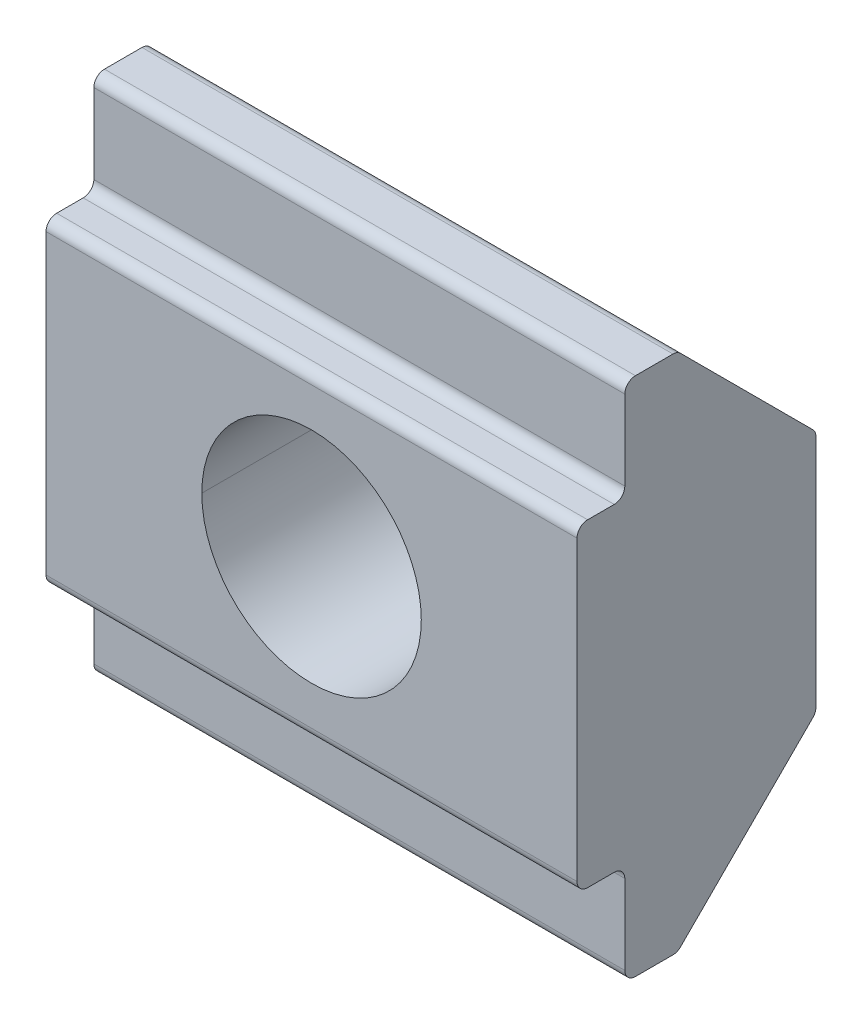
ISO-10303-21;
HEADER;
FILE_DESCRIPTION(('STEP AP214'),'2;1');
FILE_NAME('part.step','',(''),(''),'','','');
FILE_SCHEMA(('AUTOMOTIVE_DESIGN { 1 0 10303 214 1 1 1 1 }'));
ENDSEC;
DATA;
#1=APPLICATION_CONTEXT('core data for automotive mechanical design processes');
#2=APPLICATION_PROTOCOL_DEFINITION('international standard','automotive_design',2000,#1);
#3=PRODUCT_CONTEXT('',#1,'mechanical');
#4=PRODUCT('Part','Part','',(#3));
#5=PRODUCT_RELATED_PRODUCT_CATEGORY('part','',(#4));
#6=PRODUCT_DEFINITION_FORMATION('','',#4);
#7=PRODUCT_DEFINITION_CONTEXT('part definition',#1,'design');
#8=PRODUCT_DEFINITION('design','',#6,#7);
#9=PRODUCT_DEFINITION_SHAPE('','',#8);
#10=(LENGTH_UNIT() NAMED_UNIT(*) SI_UNIT(.MILLI.,.METRE.));
#11=(NAMED_UNIT(*) PLANE_ANGLE_UNIT() SI_UNIT($,.RADIAN.));
#12=(NAMED_UNIT(*) SI_UNIT($,.STERADIAN.) SOLID_ANGLE_UNIT());
#13=UNCERTAINTY_MEASURE_WITH_UNIT(LENGTH_MEASURE(1.E-05),#10,'distance_accuracy_value','');
#14=(GEOMETRIC_REPRESENTATION_CONTEXT(3) GLOBAL_UNCERTAINTY_ASSIGNED_CONTEXT((#13)) GLOBAL_UNIT_ASSIGNED_CONTEXT((#10,
#11,#12)) REPRESENTATION_CONTEXT('',''));
#15=CARTESIAN_POINT('',(0.,0.,0.));
#16=DIRECTION('',(0.,0.,1.));
#17=DIRECTION('',(1.,0.,0.));
#18=AXIS2_PLACEMENT_3D('',#15,#16,#17);
#19=CARTESIAN_POINT('',(5.,-2.20715728752538,-4.3));
#20=DIRECTION('',(-1.,0.,0.));
#21=DIRECTION('',(0.,0.382683432365152,0.923879532511261));
#22=AXIS2_PLACEMENT_3D('',#19,#20,#21);
#23=CYLINDRICAL_SURFACE('',#22,0.20000000000003);
#24=CARTESIAN_POINT('',(-5.,-2.20715728752538,-4.3));
#25=DIRECTION('',(1.,0.,0.));
#26=DIRECTION('',(0.,0.,1.));
#27=AXIS2_PLACEMENT_3D('',#24,#25,#26);
#28=CIRCLE('',#27,0.20000000000003);
#29=CARTESIAN_POINT('',(-5.,-2.3485786437627,-4.44142135623731));
#30=VERTEX_POINT('',#29);
#31=CARTESIAN_POINT('',(-5.,-2.2071572875254,-4.5));
#32=VERTEX_POINT('',#31);
#33=EDGE_CURVE('E10',#30,#32,#28,.T.);
#34=ORIENTED_EDGE('',*,*,#33,.T.);
#35=DIRECTION('',(-1.,0.,0.));
#36=VECTOR('',#35,1.);
#37=CARTESIAN_POINT('',(5.,-2.2071572875254,-4.5));
#38=LINE('',#37,#36);
#39=CARTESIAN_POINT('',(5.,-2.2071572875254,-4.5));
#40=VERTEX_POINT('',#39);
#41=EDGE_CURVE('E24',#40,#32,#38,.T.);
#42=ORIENTED_EDGE('',*,*,#41,.F.);
#43=CARTESIAN_POINT('',(5.,-2.20715728752538,-4.3));
#44=DIRECTION('',(1.,0.,0.));
#45=DIRECTION('',(0.,0.,1.));
#46=AXIS2_PLACEMENT_3D('',#43,#44,#45);
#47=CIRCLE('',#46,0.20000000000003);
#48=CARTESIAN_POINT('',(5.,-2.3485786437627,-4.44142135623731));
#49=VERTEX_POINT('',#48);
#50=EDGE_CURVE('E446',#49,#40,#47,.T.);
#51=ORIENTED_EDGE('',*,*,#50,.F.);
#52=DIRECTION('',(-1.,0.,0.));
#53=VECTOR('',#52,1.);
#54=CARTESIAN_POINT('',(5.,-2.3485786437627,-4.44142135623731));
#55=LINE('',#54,#53);
#56=EDGE_CURVE('E442',#49,#30,#55,.T.);
#57=ORIENTED_EDGE('',*,*,#56,.T.);
#58=EDGE_LOOP('',(#34,#42,#51,#57));
#59=FACE_BOUND('',#58,.T.);
#60=ADVANCED_FACE('F16',(#59),#23,.T.);
#61=CARTESIAN_POINT('',(5.,-4.8414213562373,-1.9485786437627));
#62=DIRECTION('',(0.,0.707106781186549,0.707106781186546));
#63=DIRECTION('',(0.,-0.707106781186546,0.707106781186549));
#64=AXIS2_PLACEMENT_3D('',#61,#62,#63);
#65=PLANE('',#64);
#66=DIRECTION('',(0.,0.707106781186546,-0.707106781186549));
#67=VECTOR('',#66,1.);
#68=CARTESIAN_POINT('',(-5.,-4.8414213562373,-1.9485786437627));
#69=LINE('',#68,#67);
#70=CARTESIAN_POINT('',(-5.,-4.8414213562373,-1.9485786437627));
#71=VERTEX_POINT('',#70);
#72=EDGE_CURVE('E437',#71,#30,#69,.T.);
#73=ORIENTED_EDGE('',*,*,#72,.T.);
#74=ORIENTED_EDGE('',*,*,#56,.F.);
#75=DIRECTION('',(0.,0.707106781186546,-0.707106781186549));
#76=VECTOR('',#75,1.);
#77=CARTESIAN_POINT('',(5.,-4.8414213562373,-1.9485786437627));
#78=LINE('',#77,#76);
#79=CARTESIAN_POINT('',(5.,-4.8414213562373,-1.9485786437627));
#80=VERTEX_POINT('',#79);
#81=EDGE_CURVE('E432',#80,#49,#78,.T.);
#82=ORIENTED_EDGE('',*,*,#81,.F.);
#83=DIRECTION('',(-1.,0.,0.));
#84=VECTOR('',#83,1.);
#85=CARTESIAN_POINT('',(5.,-4.8414213562373,-1.9485786437627));
#86=LINE('',#85,#84);
#87=EDGE_CURVE('E428',#80,#71,#86,.T.);
#88=ORIENTED_EDGE('',*,*,#87,.T.);
#89=EDGE_LOOP('',(#73,#74,#82,#88));
#90=FACE_BOUND('',#89,.T.);
#91=ADVANCED_FACE('F466',(#90),#65,.F.);
#92=CARTESIAN_POINT('',(5.,-4.70000000000049,-1.80715728752558));
#93=DIRECTION('',(-1.,0.,0.));
#94=DIRECTION('',(0.,0.923879532511249,0.382683432365181));
#95=AXIS2_PLACEMENT_3D('',#92,#93,#94);
#96=CYLINDRICAL_SURFACE('',#95,0.199999999999515);
#97=CARTESIAN_POINT('',(-5.,-4.70000000000049,-1.80715728752558));
#98=DIRECTION('',(1.,0.,0.));
#99=DIRECTION('',(0.,0.,1.));
#100=AXIS2_PLACEMENT_3D('',#97,#98,#99);
#101=CIRCLE('',#100,0.199999999999515);
#102=CARTESIAN_POINT('',(-5.,-4.9,-1.8071572875254));
#103=VERTEX_POINT('',#102);
#104=EDGE_CURVE('E423',#103,#71,#101,.T.);
#105=ORIENTED_EDGE('',*,*,#104,.T.);
#106=ORIENTED_EDGE('',*,*,#87,.F.);
#107=CARTESIAN_POINT('',(5.,-4.70000000000049,-1.80715728752558));
#108=DIRECTION('',(1.,0.,0.));
#109=DIRECTION('',(0.,0.,1.));
#110=AXIS2_PLACEMENT_3D('',#107,#108,#109);
#111=CIRCLE('',#110,0.199999999999515);
#112=CARTESIAN_POINT('',(5.,-4.9,-1.8071572875254));
#113=VERTEX_POINT('',#112);
#114=EDGE_CURVE('E418',#113,#80,#111,.T.);
#115=ORIENTED_EDGE('',*,*,#114,.F.);
#116=DIRECTION('',(-1.,0.,0.));
#117=VECTOR('',#116,1.);
#118=CARTESIAN_POINT('',(5.,-4.9,-1.8071572875254));
#119=LINE('',#118,#117);
#120=EDGE_CURVE('E414',#113,#103,#119,.T.);
#121=ORIENTED_EDGE('',*,*,#120,.T.);
#122=EDGE_LOOP('',(#105,#106,#115,#121));
#123=FACE_BOUND('',#122,.T.);
#124=ADVANCED_FACE('F547',(#123),#96,.T.);
#125=CARTESIAN_POINT('',(5.,-4.9,-1.1));
#126=DIRECTION('',(0.,1.,0.));
#127=DIRECTION('',(0.,0.,1.));
#128=AXIS2_PLACEMENT_3D('',#125,#126,#127);
#129=PLANE('',#128);
#130=DIRECTION('',(0.,0.,-1.));
#131=VECTOR('',#130,1.);
#132=CARTESIAN_POINT('',(-5.,-4.9,-1.1));
#133=LINE('',#132,#131);
#134=CARTESIAN_POINT('',(-5.,-4.9,-1.1));
#135=VERTEX_POINT('',#134);
#136=EDGE_CURVE('E409',#135,#103,#133,.T.);
#137=ORIENTED_EDGE('',*,*,#136,.T.);
#138=ORIENTED_EDGE('',*,*,#120,.F.);
#139=DIRECTION('',(0.,0.,-1.));
#140=VECTOR('',#139,1.);
#141=CARTESIAN_POINT('',(5.,-4.9,-1.1));
#142=LINE('',#141,#140);
#143=CARTESIAN_POINT('',(5.,-4.9,-1.1));
#144=VERTEX_POINT('',#143);
#145=EDGE_CURVE('E404',#144,#113,#142,.T.);
#146=ORIENTED_EDGE('',*,*,#145,.F.);
#147=DIRECTION('',(-1.,0.,0.));
#148=VECTOR('',#147,1.);
#149=CARTESIAN_POINT('',(5.,-4.9,-1.1));
#150=LINE('',#149,#148);
#151=EDGE_CURVE('E400',#144,#135,#150,.T.);
#152=ORIENTED_EDGE('',*,*,#151,.T.);
#153=EDGE_LOOP('',(#137,#138,#146,#152));
#154=FACE_BOUND('',#153,.T.);
#155=ADVANCED_FACE('F544',(#154),#129,.F.);
#156=CARTESIAN_POINT('',(5.,-4.7,-1.10000000000003));
#157=DIRECTION('',(-1.,0.,0.));
#158=DIRECTION('',(0.,0.707106781186488,-0.707106781186607));
#159=AXIS2_PLACEMENT_3D('',#156,#157,#158);
#160=CYLINDRICAL_SURFACE('',#159,0.200000000000035);
#161=CARTESIAN_POINT('',(-5.,-4.7,-1.10000000000003));
#162=DIRECTION('',(1.,0.,0.));
#163=DIRECTION('',(0.,0.,1.));
#164=AXIS2_PLACEMENT_3D('',#161,#162,#163);
#165=CIRCLE('',#164,0.200000000000035);
#166=CARTESIAN_POINT('',(-5.,-4.7,-0.9));
#167=VERTEX_POINT('',#166);
#168=EDGE_CURVE('E395',#167,#135,#165,.T.);
#169=ORIENTED_EDGE('',*,*,#168,.T.);
#170=ORIENTED_EDGE('',*,*,#151,.F.);
#171=CARTESIAN_POINT('',(5.,-4.7,-1.10000000000003));
#172=DIRECTION('',(1.,0.,0.));
#173=DIRECTION('',(0.,0.,1.));
#174=AXIS2_PLACEMENT_3D('',#171,#172,#173);
#175=CIRCLE('',#174,0.200000000000035);
#176=CARTESIAN_POINT('',(5.,-4.7,-0.9));
#177=VERTEX_POINT('',#176);
#178=EDGE_CURVE('E390',#177,#144,#175,.T.);
#179=ORIENTED_EDGE('',*,*,#178,.F.);
#180=DIRECTION('',(-1.,0.,0.));
#181=VECTOR('',#180,1.);
#182=CARTESIAN_POINT('',(5.,-4.7,-0.9));
#183=LINE('',#182,#181);
#184=EDGE_CURVE('E386',#177,#167,#183,.T.);
#185=ORIENTED_EDGE('',*,*,#184,.T.);
#186=EDGE_LOOP('',(#169,#170,#179,#185));
#187=FACE_BOUND('',#186,.T.);
#188=ADVANCED_FACE('F541',(#187),#160,.T.);
#189=CARTESIAN_POINT('',(5.,-3.2,-0.9));
#190=DIRECTION('',(0.,0.,-1.));
#191=DIRECTION('',(-1.,0.,0.));
#192=AXIS2_PLACEMENT_3D('',#189,#190,#191);
#193=PLANE('',#192);
#194=DIRECTION('',(0.,-1.,0.));
#195=VECTOR('',#194,1.);
#196=CARTESIAN_POINT('',(-5.,-3.2,-0.9));
#197=LINE('',#196,#195);
#198=CARTESIAN_POINT('',(-5.,-3.2,-0.9));
#199=VERTEX_POINT('',#198);
#200=EDGE_CURVE('E381',#199,#167,#197,.T.);
#201=ORIENTED_EDGE('',*,*,#200,.T.);
#202=ORIENTED_EDGE('',*,*,#184,.F.);
#203=DIRECTION('',(0.,-1.,0.));
#204=VECTOR('',#203,1.);
#205=CARTESIAN_POINT('',(5.,-3.2,-0.9));
#206=LINE('',#205,#204);
#207=CARTESIAN_POINT('',(5.,-3.2,-0.9));
#208=VERTEX_POINT('',#207);
#209=EDGE_CURVE('E376',#208,#177,#206,.T.);
#210=ORIENTED_EDGE('',*,*,#209,.F.);
#211=DIRECTION('',(-1.,0.,0.));
#212=VECTOR('',#211,1.);
#213=CARTESIAN_POINT('',(5.,-3.2,-0.9));
#214=LINE('',#213,#212);
#215=EDGE_CURVE('E372',#208,#199,#214,.T.);
#216=ORIENTED_EDGE('',*,*,#215,.T.);
#217=EDGE_LOOP('',(#201,#202,#210,#216));
#218=FACE_BOUND('',#217,.T.);
#219=ADVANCED_FACE('F538',(#218),#193,.F.);
#220=CARTESIAN_POINT('',(5.,-3.2,-0.699999999999968));
#221=DIRECTION('',(-1.,0.,0.));
#222=DIRECTION('',(0.,-0.707106781186491,0.707106781186604));
#223=AXIS2_PLACEMENT_3D('',#220,#221,#222);
#224=CYLINDRICAL_SURFACE('',#223,0.200000000000032);
#225=CARTESIAN_POINT('',(-5.,-3.2,-0.699999999999968));
#226=DIRECTION('',(1.,0.,0.));
#227=DIRECTION('',(0.,0.,1.));
#228=AXIS2_PLACEMENT_3D('',#225,#226,#227);
#229=CIRCLE('',#228,0.200000000000032);
#230=CARTESIAN_POINT('',(-5.,-3.,-0.7));
#231=VERTEX_POINT('',#230);
#232=EDGE_CURVE('E367',#199,#231,#229,.T.);
#233=ORIENTED_EDGE('',*,*,#232,.F.);
#234=ORIENTED_EDGE('',*,*,#215,.F.);
#235=CARTESIAN_POINT('',(5.,-3.2,-0.699999999999968));
#236=DIRECTION('',(1.,0.,0.));
#237=DIRECTION('',(0.,0.,1.));
#238=AXIS2_PLACEMENT_3D('',#235,#236,#237);
#239=CIRCLE('',#238,0.200000000000032);
#240=CARTESIAN_POINT('',(5.,-3.,-0.7));
#241=VERTEX_POINT('',#240);
#242=EDGE_CURVE('E363',#208,#241,#239,.T.);
#243=ORIENTED_EDGE('',*,*,#242,.T.);
#244=DIRECTION('',(-1.,0.,0.));
#245=VECTOR('',#244,1.);
#246=CARTESIAN_POINT('',(5.,-3.,-0.7));
#247=LINE('',#246,#245);
#248=EDGE_CURVE('E359',#241,#231,#247,.T.);
#249=ORIENTED_EDGE('',*,*,#248,.T.);
#250=EDGE_LOOP('',(#233,#234,#243,#249));
#251=FACE_BOUND('',#250,.T.);
#252=ADVANCED_FACE('F532',(#251),#224,.F.);
#253=CARTESIAN_POINT('',(5.,-3.,-0.2));
#254=DIRECTION('',(0.,1.,0.));
#255=DIRECTION('',(0.,0.,1.));
#256=AXIS2_PLACEMENT_3D('',#253,#254,#255);
#257=PLANE('',#256);
#258=DIRECTION('',(0.,0.,-1.));
#259=VECTOR('',#258,1.);
#260=CARTESIAN_POINT('',(-5.,-3.,-0.2));
#261=LINE('',#260,#259);
#262=CARTESIAN_POINT('',(-5.,-3.,-0.2));
#263=VERTEX_POINT('',#262);
#264=EDGE_CURVE('E354',#263,#231,#261,.T.);
#265=ORIENTED_EDGE('',*,*,#264,.T.);
#266=ORIENTED_EDGE('',*,*,#248,.F.);
#267=DIRECTION('',(0.,0.,-1.));
#268=VECTOR('',#267,1.);
#269=CARTESIAN_POINT('',(5.,-3.,-0.2));
#270=LINE('',#269,#268);
#271=CARTESIAN_POINT('',(5.,-3.,-0.2));
#272=VERTEX_POINT('',#271);
#273=EDGE_CURVE('E349',#272,#241,#270,.T.);
#274=ORIENTED_EDGE('',*,*,#273,.F.);
#275=DIRECTION('',(-1.,0.,0.));
#276=VECTOR('',#275,1.);
#277=CARTESIAN_POINT('',(5.,-3.,-0.2));
#278=LINE('',#277,#276);
#279=EDGE_CURVE('E345',#272,#263,#278,.T.);
#280=ORIENTED_EDGE('',*,*,#279,.T.);
#281=EDGE_LOOP('',(#265,#266,#274,#280));
#282=FACE_BOUND('',#281,.T.);
#283=ADVANCED_FACE('F529',(#282),#257,.F.);
#284=CARTESIAN_POINT('',(5.,-2.79999999999996,-0.200000000000033));
#285=DIRECTION('',(-1.,0.,0.));
#286=DIRECTION('',(0.,0.707106781186552,-0.707106781186543));
#287=AXIS2_PLACEMENT_3D('',#284,#285,#286);
#288=CYLINDRICAL_SURFACE('',#287,0.200000000000033);
#289=CARTESIAN_POINT('',(-5.,-2.79999999999996,-0.200000000000033));
#290=DIRECTION('',(1.,0.,0.));
#291=DIRECTION('',(0.,0.,1.));
#292=AXIS2_PLACEMENT_3D('',#289,#290,#291);
#293=CIRCLE('',#292,0.200000000000033);
#294=CARTESIAN_POINT('',(-5.,-2.8,0.));
#295=VERTEX_POINT('',#294);
#296=EDGE_CURVE('E340',#295,#263,#293,.T.);
#297=ORIENTED_EDGE('',*,*,#296,.T.);
#298=ORIENTED_EDGE('',*,*,#279,.F.);
#299=CARTESIAN_POINT('',(5.,-2.79999999999996,-0.200000000000033));
#300=DIRECTION('',(1.,0.,0.));
#301=DIRECTION('',(0.,0.,1.));
#302=AXIS2_PLACEMENT_3D('',#299,#300,#301);
#303=CIRCLE('',#302,0.200000000000033);
#304=CARTESIAN_POINT('',(5.,-2.8,0.));
#305=VERTEX_POINT('',#304);
#306=EDGE_CURVE('E335',#305,#272,#303,.T.);
#307=ORIENTED_EDGE('',*,*,#306,.F.);
#308=DIRECTION('',(-1.,0.,0.));
#309=VECTOR('',#308,1.);
#310=CARTESIAN_POINT('',(5.,-2.8,0.));
#311=LINE('',#310,#309);
#312=EDGE_CURVE('E331',#305,#295,#311,.T.);
#313=ORIENTED_EDGE('',*,*,#312,.T.);
#314=EDGE_LOOP('',(#297,#298,#307,#313));
#315=FACE_BOUND('',#314,.T.);
#316=ADVANCED_FACE('F526',(#315),#288,.T.);
#317=CARTESIAN_POINT('',(5.,2.8,0.));
#318=DIRECTION('',(0.,0.,-1.));
#319=DIRECTION('',(-1.,0.,0.));
#320=AXIS2_PLACEMENT_3D('',#317,#318,#319);
#321=PLANE('',#320);
#322=CARTESIAN_POINT('',(0.,0.,0.));
#323=DIRECTION('',(0.,0.,-1.));
#324=DIRECTION('',(-1.,0.,0.));
#325=AXIS2_PLACEMENT_3D('',#322,#323,#324);
#326=CIRCLE('',#325,2.067);
#327=CARTESIAN_POINT('',(-2.067,0.,0.));
#328=VERTEX_POINT('',#327);
#329=CARTESIAN_POINT('',(2.067,0.,0.));
#330=VERTEX_POINT('',#329);
#331=EDGE_CURVE('E175',#328,#330,#326,.T.);
#332=ORIENTED_EDGE('',*,*,#331,.T.);
#333=CARTESIAN_POINT('',(0.,0.,0.));
#334=DIRECTION('',(0.,0.,-1.));
#335=DIRECTION('',(-1.,0.,0.));
#336=AXIS2_PLACEMENT_3D('',#333,#334,#335);
#337=CIRCLE('',#336,2.067);
#338=EDGE_CURVE('E324',#330,#328,#337,.T.);
#339=ORIENTED_EDGE('',*,*,#338,.T.);
#340=EDGE_LOOP('',(#332,#339));
#341=FACE_BOUND('',#340,.T.);
#342=DIRECTION('',(0.,-1.,0.));
#343=VECTOR('',#342,1.);
#344=CARTESIAN_POINT('',(-5.,2.8,0.));
#345=LINE('',#344,#343);
#346=CARTESIAN_POINT('',(-5.,2.8,0.));
#347=VERTEX_POINT('',#346);
#348=EDGE_CURVE('E319',#347,#295,#345,.T.);
#349=ORIENTED_EDGE('',*,*,#348,.T.);
#350=ORIENTED_EDGE('',*,*,#312,.F.);
#351=DIRECTION('',(0.,-1.,0.));
#352=VECTOR('',#351,1.);
#353=CARTESIAN_POINT('',(5.,2.8,0.));
#354=LINE('',#353,#352);
#355=CARTESIAN_POINT('',(5.,2.8,0.));
#356=VERTEX_POINT('',#355);
#357=EDGE_CURVE('E314',#356,#305,#354,.T.);
#358=ORIENTED_EDGE('',*,*,#357,.F.);
#359=DIRECTION('',(-1.,0.,0.));
#360=VECTOR('',#359,1.);
#361=CARTESIAN_POINT('',(5.,2.8,0.));
#362=LINE('',#361,#360);
#363=EDGE_CURVE('E310',#356,#347,#362,.T.);
#364=ORIENTED_EDGE('',*,*,#363,.T.);
#365=EDGE_LOOP('',(#349,#350,#358,#364));
#366=FACE_BOUND('',#365,.T.);
#367=ADVANCED_FACE('F519',(#341,#366),#321,.F.);
#368=CARTESIAN_POINT('',(5.,2.79999999999996,-0.200000000000034));
#369=DIRECTION('',(-1.,0.,0.));
#370=DIRECTION('',(0.,-0.707106781186489,-0.707106781186607));
#371=AXIS2_PLACEMENT_3D('',#368,#369,#370);
#372=CYLINDRICAL_SURFACE('',#371,0.200000000000033);
#373=CARTESIAN_POINT('',(-5.,2.79999999999996,-0.200000000000034));
#374=DIRECTION('',(1.,0.,0.));
#375=DIRECTION('',(0.,0.,1.));
#376=AXIS2_PLACEMENT_3D('',#373,#374,#375);
#377=CIRCLE('',#376,0.200000000000033);
#378=CARTESIAN_POINT('',(-5.,3.,-0.2));
#379=VERTEX_POINT('',#378);
#380=EDGE_CURVE('E305',#379,#347,#377,.T.);
#381=ORIENTED_EDGE('',*,*,#380,.T.);
#382=ORIENTED_EDGE('',*,*,#363,.F.);
#383=CARTESIAN_POINT('',(5.,2.79999999999996,-0.200000000000034));
#384=DIRECTION('',(1.,0.,0.));
#385=DIRECTION('',(0.,0.,1.));
#386=AXIS2_PLACEMENT_3D('',#383,#384,#385);
#387=CIRCLE('',#386,0.200000000000033);
#388=CARTESIAN_POINT('',(5.,3.,-0.2));
#389=VERTEX_POINT('',#388);
#390=EDGE_CURVE('E300',#389,#356,#387,.T.);
#391=ORIENTED_EDGE('',*,*,#390,.F.);
#392=DIRECTION('',(-1.,0.,0.));
#393=VECTOR('',#392,1.);
#394=CARTESIAN_POINT('',(5.,3.,-0.2));
#395=LINE('',#394,#393);
#396=EDGE_CURVE('E296',#389,#379,#395,.T.);
#397=ORIENTED_EDGE('',*,*,#396,.T.);
#398=EDGE_LOOP('',(#381,#382,#391,#397));
#399=FACE_BOUND('',#398,.T.);
#400=ADVANCED_FACE('F516',(#399),#372,.T.);
#401=CARTESIAN_POINT('',(5.,3.,-0.7));
#402=DIRECTION('',(0.,-1.,0.));
#403=DIRECTION('',(0.,0.,-1.));
#404=AXIS2_PLACEMENT_3D('',#401,#402,#403);
#405=PLANE('',#404);
#406=DIRECTION('',(0.,0.,1.));
#407=VECTOR('',#406,1.);
#408=CARTESIAN_POINT('',(-5.,3.,-0.7));
#409=LINE('',#408,#407);
#410=CARTESIAN_POINT('',(-5.,3.,-0.7));
#411=VERTEX_POINT('',#410);
#412=EDGE_CURVE('E291',#411,#379,#409,.T.);
#413=ORIENTED_EDGE('',*,*,#412,.T.);
#414=ORIENTED_EDGE('',*,*,#396,.F.);
#415=DIRECTION('',(0.,0.,1.));
#416=VECTOR('',#415,1.);
#417=CARTESIAN_POINT('',(5.,3.,-0.7));
#418=LINE('',#417,#416);
#419=CARTESIAN_POINT('',(5.,3.,-0.7));
#420=VERTEX_POINT('',#419);
#421=EDGE_CURVE('E286',#420,#389,#418,.T.);
#422=ORIENTED_EDGE('',*,*,#421,.F.);
#423=DIRECTION('',(-1.,0.,0.));
#424=VECTOR('',#423,1.);
#425=CARTESIAN_POINT('',(5.,3.,-0.7));
#426=LINE('',#425,#424);
#427=EDGE_CURVE('E282',#420,#411,#426,.T.);
#428=ORIENTED_EDGE('',*,*,#427,.T.);
#429=EDGE_LOOP('',(#413,#414,#422,#428));
#430=FACE_BOUND('',#429,.T.);
#431=ADVANCED_FACE('F513',(#430),#405,.F.);
#432=CARTESIAN_POINT('',(5.,3.2,-0.699999999999968));
#433=DIRECTION('',(-1.,0.,0.));
#434=DIRECTION('',(0.,0.707106781186491,0.707106781186604));
#435=AXIS2_PLACEMENT_3D('',#432,#433,#434);
#436=CYLINDRICAL_SURFACE('',#435,0.200000000000032);
#437=CARTESIAN_POINT('',(-5.,3.2,-0.699999999999968));
#438=DIRECTION('',(1.,0.,0.));
#439=DIRECTION('',(0.,0.,1.));
#440=AXIS2_PLACEMENT_3D('',#437,#438,#439);
#441=CIRCLE('',#440,0.200000000000032);
#442=CARTESIAN_POINT('',(-5.,3.2,-0.9));
#443=VERTEX_POINT('',#442);
#444=EDGE_CURVE('E277',#411,#443,#441,.T.);
#445=ORIENTED_EDGE('',*,*,#444,.F.);
#446=ORIENTED_EDGE('',*,*,#427,.F.);
#447=CARTESIAN_POINT('',(5.,3.2,-0.699999999999968));
#448=DIRECTION('',(1.,0.,0.));
#449=DIRECTION('',(0.,0.,1.));
#450=AXIS2_PLACEMENT_3D('',#447,#448,#449);
#451=CIRCLE('',#450,0.200000000000032);
#452=CARTESIAN_POINT('',(5.,3.2,-0.9));
#453=VERTEX_POINT('',#452);
#454=EDGE_CURVE('E273',#420,#453,#451,.T.);
#455=ORIENTED_EDGE('',*,*,#454,.T.);
#456=DIRECTION('',(-1.,0.,0.));
#457=VECTOR('',#456,1.);
#458=CARTESIAN_POINT('',(5.,3.2,-0.9));
#459=LINE('',#458,#457);
#460=EDGE_CURVE('E269',#453,#443,#459,.T.);
#461=ORIENTED_EDGE('',*,*,#460,.T.);
#462=EDGE_LOOP('',(#445,#446,#455,#461));
#463=FACE_BOUND('',#462,.T.);
#464=ADVANCED_FACE('F507',(#463),#436,.F.);
#465=CARTESIAN_POINT('',(5.,4.7,-0.9));
#466=DIRECTION('',(0.,0.,-1.));
#467=DIRECTION('',(-1.,0.,0.));
#468=AXIS2_PLACEMENT_3D('',#465,#466,#467);
#469=PLANE('',#468);
#470=DIRECTION('',(0.,-1.,0.));
#471=VECTOR('',#470,1.);
#472=CARTESIAN_POINT('',(-5.,4.7,-0.9));
#473=LINE('',#472,#471);
#474=CARTESIAN_POINT('',(-5.,4.7,-0.9));
#475=VERTEX_POINT('',#474);
#476=EDGE_CURVE('E264',#475,#443,#473,.T.);
#477=ORIENTED_EDGE('',*,*,#476,.T.);
#478=ORIENTED_EDGE('',*,*,#460,.F.);
#479=DIRECTION('',(0.,-1.,0.));
#480=VECTOR('',#479,1.);
#481=CARTESIAN_POINT('',(5.,4.7,-0.9));
#482=LINE('',#481,#480);
#483=CARTESIAN_POINT('',(5.,4.7,-0.9));
#484=VERTEX_POINT('',#483);
#485=EDGE_CURVE('E259',#484,#453,#482,.T.);
#486=ORIENTED_EDGE('',*,*,#485,.F.);
#487=DIRECTION('',(-1.,0.,0.));
#488=VECTOR('',#487,1.);
#489=CARTESIAN_POINT('',(5.,4.7,-0.9));
#490=LINE('',#489,#488);
#491=EDGE_CURVE('E255',#484,#475,#490,.T.);
#492=ORIENTED_EDGE('',*,*,#491,.T.);
#493=EDGE_LOOP('',(#477,#478,#486,#492));
#494=FACE_BOUND('',#493,.T.);
#495=ADVANCED_FACE('F504',(#494),#469,.F.);
#496=CARTESIAN_POINT('',(5.,4.7,-1.10000000000003));
#497=DIRECTION('',(-1.,0.,0.));
#498=DIRECTION('',(0.,-0.707106781186488,-0.707106781186607));
#499=AXIS2_PLACEMENT_3D('',#496,#497,#498);
#500=CYLINDRICAL_SURFACE('',#499,0.200000000000035);
#501=CARTESIAN_POINT('',(-5.,4.7,-1.10000000000003));
#502=DIRECTION('',(1.,0.,0.));
#503=DIRECTION('',(0.,0.,1.));
#504=AXIS2_PLACEMENT_3D('',#501,#502,#503);
#505=CIRCLE('',#504,0.200000000000035);
#506=CARTESIAN_POINT('',(-5.,4.9,-1.1));
#507=VERTEX_POINT('',#506);
#508=EDGE_CURVE('E250',#507,#475,#505,.T.);
#509=ORIENTED_EDGE('',*,*,#508,.T.);
#510=ORIENTED_EDGE('',*,*,#491,.F.);
#511=CARTESIAN_POINT('',(5.,4.7,-1.10000000000003));
#512=DIRECTION('',(1.,0.,0.));
#513=DIRECTION('',(0.,0.,1.));
#514=AXIS2_PLACEMENT_3D('',#511,#512,#513);
#515=CIRCLE('',#514,0.200000000000035);
#516=CARTESIAN_POINT('',(5.,4.9,-1.1));
#517=VERTEX_POINT('',#516);
#518=EDGE_CURVE('E245',#517,#484,#515,.T.);
#519=ORIENTED_EDGE('',*,*,#518,.F.);
#520=DIRECTION('',(-1.,0.,0.));
#521=VECTOR('',#520,1.);
#522=CARTESIAN_POINT('',(5.,4.9,-1.1));
#523=LINE('',#522,#521);
#524=EDGE_CURVE('E241',#517,#507,#523,.T.);
#525=ORIENTED_EDGE('',*,*,#524,.T.);
#526=EDGE_LOOP('',(#509,#510,#519,#525));
#527=FACE_BOUND('',#526,.T.);
#528=ADVANCED_FACE('F501',(#527),#500,.T.);
#529=CARTESIAN_POINT('',(5.,4.9,-1.8071572875254));
#530=DIRECTION('',(0.,-1.,0.));
#531=DIRECTION('',(0.,0.,-1.));
#532=AXIS2_PLACEMENT_3D('',#529,#530,#531);
#533=PLANE('',#532);
#534=DIRECTION('',(0.,0.,1.));
#535=VECTOR('',#534,1.);
#536=CARTESIAN_POINT('',(-5.,4.9,-1.8071572875254));
#537=LINE('',#536,#535);
#538=CARTESIAN_POINT('',(-5.,4.9,-1.8071572875254));
#539=VERTEX_POINT('',#538);
#540=EDGE_CURVE('E236',#539,#507,#537,.T.);
#541=ORIENTED_EDGE('',*,*,#540,.T.);
#542=ORIENTED_EDGE('',*,*,#524,.F.);
#543=DIRECTION('',(0.,0.,1.));
#544=VECTOR('',#543,1.);
#545=CARTESIAN_POINT('',(5.,4.9,-1.8071572875254));
#546=LINE('',#545,#544);
#547=CARTESIAN_POINT('',(5.,4.9,-1.8071572875254));
#548=VERTEX_POINT('',#547);
#549=EDGE_CURVE('E231',#548,#517,#546,.T.);
#550=ORIENTED_EDGE('',*,*,#549,.F.);
#551=DIRECTION('',(-1.,0.,0.));
#552=VECTOR('',#551,1.);
#553=CARTESIAN_POINT('',(5.,4.9,-1.8071572875254));
#554=LINE('',#553,#552);
#555=EDGE_CURVE('E227',#548,#539,#554,.T.);
#556=ORIENTED_EDGE('',*,*,#555,.T.);
#557=EDGE_LOOP('',(#541,#542,#550,#556));
#558=FACE_BOUND('',#557,.T.);
#559=ADVANCED_FACE('F494',(#558),#533,.F.);
#560=CARTESIAN_POINT('',(5.,4.70000000000049,-1.80715728752558));
#561=DIRECTION('',(-1.,0.,0.));
#562=DIRECTION('',(0.,-0.923879532511249,0.382683432365181));
#563=AXIS2_PLACEMENT_3D('',#560,#561,#562);
#564=CYLINDRICAL_SURFACE('',#563,0.199999999999515);
#565=CARTESIAN_POINT('',(-5.,4.70000000000049,-1.80715728752558));
#566=DIRECTION('',(1.,0.,0.));
#567=DIRECTION('',(0.,0.,1.));
#568=AXIS2_PLACEMENT_3D('',#565,#566,#567);
#569=CIRCLE('',#568,0.199999999999515);
#570=CARTESIAN_POINT('',(-5.,4.8414213562373,-1.9485786437627));
#571=VERTEX_POINT('',#570);
#572=EDGE_CURVE('E222',#571,#539,#569,.T.);
#573=ORIENTED_EDGE('',*,*,#572,.T.);
#574=ORIENTED_EDGE('',*,*,#555,.F.);
#575=CARTESIAN_POINT('',(5.,4.70000000000049,-1.80715728752558));
#576=DIRECTION('',(1.,0.,0.));
#577=DIRECTION('',(0.,0.,1.));
#578=AXIS2_PLACEMENT_3D('',#575,#576,#577);
#579=CIRCLE('',#578,0.199999999999515);
#580=CARTESIAN_POINT('',(5.,4.8414213562373,-1.9485786437627));
#581=VERTEX_POINT('',#580);
#582=EDGE_CURVE('E217',#581,#548,#579,.T.);
#583=ORIENTED_EDGE('',*,*,#582,.F.);
#584=DIRECTION('',(-1.,0.,0.));
#585=VECTOR('',#584,1.);
#586=CARTESIAN_POINT('',(5.,4.8414213562373,-1.9485786437627));
#587=LINE('',#586,#585);
#588=EDGE_CURVE('E213',#581,#571,#587,.T.);
#589=ORIENTED_EDGE('',*,*,#588,.T.);
#590=EDGE_LOOP('',(#573,#574,#583,#589));
#591=FACE_BOUND('',#590,.T.);
#592=ADVANCED_FACE('F491',(#591),#564,.T.);
#593=CARTESIAN_POINT('',(5.,2.3485786437627,-4.44142135623731));
#594=DIRECTION('',(0.,-0.707106781186549,0.707106781186546));
#595=DIRECTION('',(0.,-0.707106781186546,-0.707106781186549));
#596=AXIS2_PLACEMENT_3D('',#593,#594,#595);
#597=PLANE('',#596);
#598=DIRECTION('',(0.,0.707106781186546,0.707106781186549));
#599=VECTOR('',#598,1.);
#600=CARTESIAN_POINT('',(-5.,2.3485786437627,-4.44142135623731));
#601=LINE('',#600,#599);
#602=CARTESIAN_POINT('',(-5.,2.3485786437627,-4.44142135623731));
#603=VERTEX_POINT('',#602);
#604=EDGE_CURVE('E208',#603,#571,#601,.T.);
#605=ORIENTED_EDGE('',*,*,#604,.T.);
#606=ORIENTED_EDGE('',*,*,#588,.F.);
#607=DIRECTION('',(0.,0.707106781186546,0.707106781186549));
#608=VECTOR('',#607,1.);
#609=CARTESIAN_POINT('',(5.,2.3485786437627,-4.44142135623731));
#610=LINE('',#609,#608);
#611=CARTESIAN_POINT('',(5.,2.3485786437627,-4.44142135623731));
#612=VERTEX_POINT('',#611);
#613=EDGE_CURVE('E203',#612,#581,#610,.T.);
#614=ORIENTED_EDGE('',*,*,#613,.F.);
#615=DIRECTION('',(-1.,0.,0.));
#616=VECTOR('',#615,1.);
#617=CARTESIAN_POINT('',(5.,2.3485786437627,-4.44142135623731));
#618=LINE('',#617,#616);
#619=EDGE_CURVE('E199',#612,#603,#618,.T.);
#620=ORIENTED_EDGE('',*,*,#619,.T.);
#621=EDGE_LOOP('',(#605,#606,#614,#620));
#622=FACE_BOUND('',#621,.T.);
#623=ADVANCED_FACE('F489',(#622),#597,.F.);
#624=CARTESIAN_POINT('',(5.,2.20715728752538,-4.29999999999995));
#625=DIRECTION('',(-1.,0.,0.));
#626=DIRECTION('',(0.,-0.382683432365097,0.923879532511284));
#627=AXIS2_PLACEMENT_3D('',#624,#625,#626);
#628=CYLINDRICAL_SURFACE('',#627,0.200000000000044);
#629=CARTESIAN_POINT('',(-5.,2.20715728752538,-4.29999999999995));
#630=DIRECTION('',(1.,0.,0.));
#631=DIRECTION('',(0.,0.,1.));
#632=AXIS2_PLACEMENT_3D('',#629,#630,#631);
#633=CIRCLE('',#632,0.200000000000044);
#634=CARTESIAN_POINT('',(-5.,2.2071572875254,-4.5));
#635=VERTEX_POINT('',#634);
#636=EDGE_CURVE('E194',#635,#603,#633,.T.);
#637=ORIENTED_EDGE('',*,*,#636,.T.);
#638=ORIENTED_EDGE('',*,*,#619,.F.);
#639=CARTESIAN_POINT('',(5.,2.20715728752538,-4.29999999999995));
#640=DIRECTION('',(1.,0.,0.));
#641=DIRECTION('',(0.,0.,1.));
#642=AXIS2_PLACEMENT_3D('',#639,#640,#641);
#643=CIRCLE('',#642,0.200000000000044);
#644=CARTESIAN_POINT('',(5.,2.2071572875254,-4.5));
#645=VERTEX_POINT('',#644);
#646=EDGE_CURVE('E183',#645,#612,#643,.T.);
#647=ORIENTED_EDGE('',*,*,#646,.F.);
#648=DIRECTION('',(-1.,0.,0.));
#649=VECTOR('',#648,1.);
#650=CARTESIAN_POINT('',(5.,2.2071572875254,-4.5));
#651=LINE('',#650,#649);
#652=EDGE_CURVE('E181',#645,#635,#651,.T.);
#653=ORIENTED_EDGE('',*,*,#652,.T.);
#654=EDGE_LOOP('',(#637,#638,#647,#653));
#655=FACE_BOUND('',#654,.T.);
#656=ADVANCED_FACE('F485',(#655),#628,.T.);
#657=CARTESIAN_POINT('',(5.,-2.2071572875254,-4.5));
#658=DIRECTION('',(0.,0.,1.));
#659=DIRECTION('',(1.,0.,0.));
#660=AXIS2_PLACEMENT_3D('',#657,#658,#659);
#661=PLANE('',#660);
#662=CARTESIAN_POINT('',(0.,0.,-4.5));
#663=DIRECTION('',(0.,0.,-1.));
#664=DIRECTION('',(-1.,0.,0.));
#665=AXIS2_PLACEMENT_3D('',#662,#663,#664);
#666=CIRCLE('',#665,2.067);
#667=CARTESIAN_POINT('',(2.067,0.,-4.5));
#668=VERTEX_POINT('',#667);
#669=CARTESIAN_POINT('',(-2.067,0.,-4.5));
#670=VERTEX_POINT('',#669);
#671=EDGE_CURVE('E165',#668,#670,#666,.T.);
#672=ORIENTED_EDGE('',*,*,#671,.F.);
#673=CARTESIAN_POINT('',(0.,0.,-4.5));
#674=DIRECTION('',(0.,0.,-1.));
#675=DIRECTION('',(-1.,0.,0.));
#676=AXIS2_PLACEMENT_3D('',#673,#674,#675);
#677=CIRCLE('',#676,2.067);
#678=EDGE_CURVE('E160',#670,#668,#677,.T.);
#679=ORIENTED_EDGE('',*,*,#678,.F.);
#680=EDGE_LOOP('',(#672,#679));
#681=FACE_BOUND('',#680,.T.);
#682=DIRECTION('',(0.,1.,0.));
#683=VECTOR('',#682,1.);
#684=CARTESIAN_POINT('',(-5.,-2.2071572875254,-4.5));
#685=LINE('',#684,#683);
#686=EDGE_CURVE('E169',#32,#635,#685,.T.);
#687=ORIENTED_EDGE('',*,*,#686,.T.);
#688=ORIENTED_EDGE('',*,*,#652,.F.);
#689=DIRECTION('',(0.,1.,0.));
#690=VECTOR('',#689,1.);
#691=CARTESIAN_POINT('',(5.,-2.2071572875254,-4.5));
#692=LINE('',#691,#690);
#693=EDGE_CURVE('E459',#40,#645,#692,.T.);
#694=ORIENTED_EDGE('',*,*,#693,.F.);
#695=ORIENTED_EDGE('',*,*,#41,.T.);
#696=EDGE_LOOP('',(#687,#688,#694,#695));
#697=FACE_BOUND('',#696,.T.);
#698=ADVANCED_FACE('F162',(#681,#697),#661,.F.);
#699=CARTESIAN_POINT('',(5.,-2.20715728752538,-4.3));
#700=DIRECTION('',(1.,0.,0.));
#701=DIRECTION('',(0.,0.,-1.));
#702=AXIS2_PLACEMENT_3D('',#699,#700,#701);
#703=PLANE('',#702);
#704=ORIENTED_EDGE('',*,*,#50,.T.);
#705=ORIENTED_EDGE('',*,*,#693,.T.);
#706=ORIENTED_EDGE('',*,*,#646,.T.);
#707=ORIENTED_EDGE('',*,*,#613,.T.);
#708=ORIENTED_EDGE('',*,*,#582,.T.);
#709=ORIENTED_EDGE('',*,*,#549,.T.);
#710=ORIENTED_EDGE('',*,*,#518,.T.);
#711=ORIENTED_EDGE('',*,*,#485,.T.);
#712=ORIENTED_EDGE('',*,*,#454,.F.);
#713=ORIENTED_EDGE('',*,*,#421,.T.);
#714=ORIENTED_EDGE('',*,*,#390,.T.);
#715=ORIENTED_EDGE('',*,*,#357,.T.);
#716=ORIENTED_EDGE('',*,*,#306,.T.);
#717=ORIENTED_EDGE('',*,*,#273,.T.);
#718=ORIENTED_EDGE('',*,*,#242,.F.);
#719=ORIENTED_EDGE('',*,*,#209,.T.);
#720=ORIENTED_EDGE('',*,*,#178,.T.);
#721=ORIENTED_EDGE('',*,*,#145,.T.);
#722=ORIENTED_EDGE('',*,*,#114,.T.);
#723=ORIENTED_EDGE('',*,*,#81,.T.);
#724=EDGE_LOOP('',(#704,#705,#706,#707,#708,#709,#710,#711,#712,#713,#714,#715,#716,#717,#718,
#719,#720,#721,#722,#723));
#725=FACE_BOUND('',#724,.T.);
#726=ADVANCED_FACE('F462',(#725),#703,.T.);
#727=CARTESIAN_POINT('',(-5.,-2.20715728752538,-4.3));
#728=DIRECTION('',(1.,0.,0.));
#729=DIRECTION('',(0.,0.,-1.));
#730=AXIS2_PLACEMENT_3D('',#727,#728,#729);
#731=PLANE('',#730);
#732=ORIENTED_EDGE('',*,*,#33,.F.);
#733=ORIENTED_EDGE('',*,*,#72,.F.);
#734=ORIENTED_EDGE('',*,*,#104,.F.);
#735=ORIENTED_EDGE('',*,*,#136,.F.);
#736=ORIENTED_EDGE('',*,*,#168,.F.);
#737=ORIENTED_EDGE('',*,*,#200,.F.);
#738=ORIENTED_EDGE('',*,*,#232,.T.);
#739=ORIENTED_EDGE('',*,*,#264,.F.);
#740=ORIENTED_EDGE('',*,*,#296,.F.);
#741=ORIENTED_EDGE('',*,*,#348,.F.);
#742=ORIENTED_EDGE('',*,*,#380,.F.);
#743=ORIENTED_EDGE('',*,*,#412,.F.);
#744=ORIENTED_EDGE('',*,*,#444,.T.);
#745=ORIENTED_EDGE('',*,*,#476,.F.);
#746=ORIENTED_EDGE('',*,*,#508,.F.);
#747=ORIENTED_EDGE('',*,*,#540,.F.);
#748=ORIENTED_EDGE('',*,*,#572,.F.);
#749=ORIENTED_EDGE('',*,*,#604,.F.);
#750=ORIENTED_EDGE('',*,*,#636,.F.);
#751=ORIENTED_EDGE('',*,*,#686,.F.);
#752=EDGE_LOOP('',(#732,#733,#734,#735,#736,#737,#738,#739,#740,#741,#742,#743,#744,#745,#746,
#747,#748,#749,#750,#751));
#753=FACE_BOUND('',#752,.T.);
#754=ADVANCED_FACE('F470',(#753),#731,.F.);
#755=CARTESIAN_POINT('',(0.,0.,-4.5));
#756=DIRECTION('',(0.,0.,-1.));
#757=DIRECTION('',(0.,-1.,0.));
#758=AXIS2_PLACEMENT_3D('',#755,#756,#757);
#759=CYLINDRICAL_SURFACE('',#758,2.067);
#760=DIRECTION('',(0.,0.,-1.));
#761=VECTOR('',#760,1.);
#762=CARTESIAN_POINT('',(2.067,0.,0.));
#763=LINE('',#762,#761);
#764=EDGE_CURVE('E178',#330,#668,#763,.T.);
#765=ORIENTED_EDGE('',*,*,#764,.F.);
#766=ORIENTED_EDGE('',*,*,#331,.F.);
#767=DIRECTION('',(0.,0.,-1.));
#768=VECTOR('',#767,1.);
#769=CARTESIAN_POINT('',(-2.067,0.,0.));
#770=LINE('',#769,#768);
#771=EDGE_CURVE('E173',#328,#670,#770,.T.);
#772=ORIENTED_EDGE('',*,*,#771,.T.);
#773=ORIENTED_EDGE('',*,*,#678,.T.);
#774=EDGE_LOOP('',(#765,#766,#772,#773));
#775=FACE_BOUND('',#774,.T.);
#776=ADVANCED_FACE('F174',(#775),#759,.F.);
#777=CARTESIAN_POINT('',(0.,0.,-4.5));
#778=DIRECTION('',(0.,0.,-1.));
#779=DIRECTION('',(0.,1.,0.));
#780=AXIS2_PLACEMENT_3D('',#777,#778,#779);
#781=CYLINDRICAL_SURFACE('',#780,2.067);
#782=ORIENTED_EDGE('',*,*,#764,.T.);
#783=ORIENTED_EDGE('',*,*,#671,.T.);
#784=ORIENTED_EDGE('',*,*,#771,.F.);
#785=ORIENTED_EDGE('',*,*,#338,.F.);
#786=EDGE_LOOP('',(#782,#783,#784,#785));
#787=FACE_BOUND('',#786,.T.);
#788=ADVANCED_FACE('F180',(#787),#781,.F.);
#789=CLOSED_SHELL('',(#60,#91,#124,#155,#188,#219,#252,#283,#316,#367,#400,#431,#464,#495,#528,
#559,#592,#623,#656,#698,#726,#754,#776,#788));
#790=MANIFOLD_SOLID_BREP('B1',#789);
#791=ADVANCED_BREP_SHAPE_REPRESENTATION('',(#18,#790),#14);
#792=SHAPE_DEFINITION_REPRESENTATION(#9,#791);
ENDSEC;
END-ISO-10303-21;
